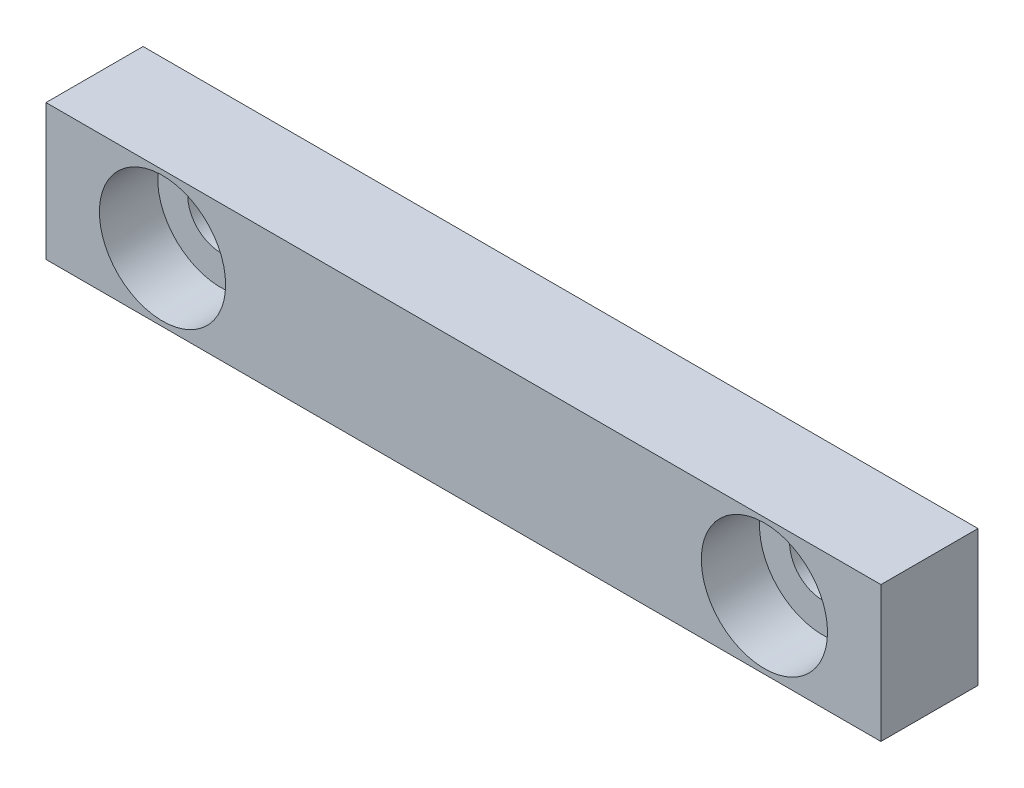
ISO-10303-21;
HEADER;
FILE_DESCRIPTION(('STEP AP214'),'2;1');
FILE_NAME('part.step','',(''),(''),'','','');
FILE_SCHEMA(('AUTOMOTIVE_DESIGN { 1 0 10303 214 1 1 1 1 }'));
ENDSEC;
DATA;
#1=APPLICATION_CONTEXT('core data for automotive mechanical design processes');
#2=APPLICATION_PROTOCOL_DEFINITION('international standard','automotive_design',2000,#1);
#3=PRODUCT_CONTEXT('',#1,'mechanical');
#4=PRODUCT('Part','Part','',(#3));
#5=PRODUCT_RELATED_PRODUCT_CATEGORY('part','',(#4));
#6=PRODUCT_DEFINITION_FORMATION('','',#4);
#7=PRODUCT_DEFINITION_CONTEXT('part definition',#1,'design');
#8=PRODUCT_DEFINITION('design','',#6,#7);
#9=PRODUCT_DEFINITION_SHAPE('','',#8);
#10=(LENGTH_UNIT() NAMED_UNIT(*) SI_UNIT(.MILLI.,.METRE.));
#11=(NAMED_UNIT(*) PLANE_ANGLE_UNIT() SI_UNIT($,.RADIAN.));
#12=(NAMED_UNIT(*) SI_UNIT($,.STERADIAN.) SOLID_ANGLE_UNIT());
#13=UNCERTAINTY_MEASURE_WITH_UNIT(LENGTH_MEASURE(1.E-05),#10,'distance_accuracy_value','');
#14=(GEOMETRIC_REPRESENTATION_CONTEXT(3) GLOBAL_UNCERTAINTY_ASSIGNED_CONTEXT((#13)) GLOBAL_UNIT_ASSIGNED_CONTEXT((#10,
#11,#12)) REPRESENTATION_CONTEXT('',''));
#15=CARTESIAN_POINT('',(0.,0.,0.));
#16=DIRECTION('',(0.,0.,1.));
#17=DIRECTION('',(1.,0.,0.));
#18=AXIS2_PLACEMENT_3D('',#15,#16,#17);
#19=CARTESIAN_POINT('',(-21.5,0.,5.));
#20=DIRECTION('',(1.,0.,0.));
#21=DIRECTION('',(0.,0.,-1.));
#22=AXIS2_PLACEMENT_3D('',#19,#20,#21);
#23=PLANE('',#22);
#24=DIRECTION('',(0.,-1.,0.));
#25=VECTOR('',#24,1.);
#26=CARTESIAN_POINT('',(-21.5,0.,0.));
#27=LINE('',#26,#25);
#28=CARTESIAN_POINT('',(-21.5,7.,0.));
#29=VERTEX_POINT('',#28);
#30=CARTESIAN_POINT('',(-21.5,0.,0.));
#31=VERTEX_POINT('',#30);
#32=EDGE_CURVE('E98',#29,#31,#27,.T.);
#33=ORIENTED_EDGE('',*,*,#32,.T.);
#34=DIRECTION('',(0.,0.,-1.));
#35=VECTOR('',#34,1.);
#36=CARTESIAN_POINT('',(-21.5,0.,5.));
#37=LINE('',#36,#35);
#38=CARTESIAN_POINT('',(-21.5,0.,5.));
#39=VERTEX_POINT('',#38);
#40=EDGE_CURVE('E11',#39,#31,#37,.T.);
#41=ORIENTED_EDGE('',*,*,#40,.F.);
#42=DIRECTION('',(0.,-1.,0.));
#43=VECTOR('',#42,1.);
#44=CARTESIAN_POINT('',(-21.5,0.,5.));
#45=LINE('',#44,#43);
#46=CARTESIAN_POINT('',(-21.5,7.,5.));
#47=VERTEX_POINT('',#46);
#48=EDGE_CURVE('E86',#47,#39,#45,.T.);
#49=ORIENTED_EDGE('',*,*,#48,.F.);
#50=DIRECTION('',(0.,0.,-1.));
#51=VECTOR('',#50,1.);
#52=CARTESIAN_POINT('',(-21.5,7.,5.));
#53=LINE('',#52,#51);
#54=EDGE_CURVE('E94',#47,#29,#53,.T.);
#55=ORIENTED_EDGE('',*,*,#54,.T.);
#56=EDGE_LOOP('',(#33,#41,#49,#55));
#57=FACE_BOUND('',#56,.T.);
#58=ADVANCED_FACE('F35',(#57),#23,.F.);
#59=CARTESIAN_POINT('',(-21.5,0.,5.));
#60=DIRECTION('',(0.,1.,0.));
#61=DIRECTION('',(0.,0.,1.));
#62=AXIS2_PLACEMENT_3D('',#59,#60,#61);
#63=PLANE('',#62);
#64=DIRECTION('',(1.,0.,0.));
#65=VECTOR('',#64,1.);
#66=CARTESIAN_POINT('',(-21.5,0.,0.));
#67=LINE('',#66,#65);
#68=CARTESIAN_POINT('',(21.5,0.,0.));
#69=VERTEX_POINT('',#68);
#70=EDGE_CURVE('E90',#31,#69,#67,.T.);
#71=ORIENTED_EDGE('',*,*,#70,.T.);
#72=DIRECTION('',(0.,0.,-1.));
#73=VECTOR('',#72,1.);
#74=CARTESIAN_POINT('',(21.5,0.,5.));
#75=LINE('',#74,#73);
#76=CARTESIAN_POINT('',(21.5,0.,5.));
#77=VERTEX_POINT('',#76);
#78=EDGE_CURVE('E43',#77,#69,#75,.T.);
#79=ORIENTED_EDGE('',*,*,#78,.F.);
#80=DIRECTION('',(1.,0.,0.));
#81=VECTOR('',#80,1.);
#82=CARTESIAN_POINT('',(-21.5,0.,5.));
#83=LINE('',#82,#81);
#84=EDGE_CURVE('E81',#39,#77,#83,.T.);
#85=ORIENTED_EDGE('',*,*,#84,.F.);
#86=ORIENTED_EDGE('',*,*,#40,.T.);
#87=EDGE_LOOP('',(#71,#79,#85,#86));
#88=FACE_BOUND('',#87,.T.);
#89=ADVANCED_FACE('F89',(#88),#63,.F.);
#90=CARTESIAN_POINT('',(21.5,0.,5.));
#91=DIRECTION('',(-1.,0.,0.));
#92=DIRECTION('',(0.,-1.,0.));
#93=AXIS2_PLACEMENT_3D('',#90,#91,#92);
#94=PLANE('',#93);
#95=DIRECTION('',(0.,1.,0.));
#96=VECTOR('',#95,1.);
#97=CARTESIAN_POINT('',(21.5,0.,0.));
#98=LINE('',#97,#96);
#99=CARTESIAN_POINT('',(21.5,7.,0.));
#100=VERTEX_POINT('',#99);
#101=EDGE_CURVE('E68',#69,#100,#98,.T.);
#102=ORIENTED_EDGE('',*,*,#101,.T.);
#103=DIRECTION('',(0.,0.,-1.));
#104=VECTOR('',#103,1.);
#105=CARTESIAN_POINT('',(21.5,7.,5.));
#106=LINE('',#105,#104);
#107=CARTESIAN_POINT('',(21.5,7.,5.));
#108=VERTEX_POINT('',#107);
#109=EDGE_CURVE('E91',#108,#100,#106,.T.);
#110=ORIENTED_EDGE('',*,*,#109,.F.);
#111=DIRECTION('',(0.,1.,0.));
#112=VECTOR('',#111,1.);
#113=CARTESIAN_POINT('',(21.5,0.,5.));
#114=LINE('',#113,#112);
#115=EDGE_CURVE('E84',#77,#108,#114,.T.);
#116=ORIENTED_EDGE('',*,*,#115,.F.);
#117=ORIENTED_EDGE('',*,*,#78,.T.);
#118=EDGE_LOOP('',(#102,#110,#116,#117));
#119=FACE_BOUND('',#118,.T.);
#120=ADVANCED_FACE('F92',(#119),#94,.F.);
#121=CARTESIAN_POINT('',(-21.5,7.,5.));
#122=DIRECTION('',(0.,-1.,0.));
#123=DIRECTION('',(1.,0.,0.));
#124=AXIS2_PLACEMENT_3D('',#121,#122,#123);
#125=PLANE('',#124);
#126=DIRECTION('',(-1.,0.,0.));
#127=VECTOR('',#126,1.);
#128=CARTESIAN_POINT('',(-21.5,7.,0.));
#129=LINE('',#128,#127);
#130=EDGE_CURVE('E74',#100,#29,#129,.T.);
#131=ORIENTED_EDGE('',*,*,#130,.T.);
#132=ORIENTED_EDGE('',*,*,#54,.F.);
#133=DIRECTION('',(-1.,0.,0.));
#134=VECTOR('',#133,1.);
#135=CARTESIAN_POINT('',(-21.5,7.,5.));
#136=LINE('',#135,#134);
#137=EDGE_CURVE('E51',#108,#47,#136,.T.);
#138=ORIENTED_EDGE('',*,*,#137,.F.);
#139=ORIENTED_EDGE('',*,*,#109,.T.);
#140=EDGE_LOOP('',(#131,#132,#138,#139));
#141=FACE_BOUND('',#140,.T.);
#142=ADVANCED_FACE('F106',(#141),#125,.F.);
#143=CARTESIAN_POINT('',(0.,0.,5.));
#144=DIRECTION('',(0.,0.,-1.));
#145=DIRECTION('',(-1.,0.,0.));
#146=AXIS2_PLACEMENT_3D('',#143,#144,#145);
#147=PLANE('',#146);
#148=CARTESIAN_POINT('',(-15.5,3.5,5.));
#149=DIRECTION('',(0.,0.,1.));
#150=DIRECTION('',(1.,0.,0.));
#151=AXIS2_PLACEMENT_3D('',#148,#149,#150);
#152=CIRCLE('',#151,3.25);
#153=CARTESIAN_POINT('',(-12.25,3.5,5.));
#154=VERTEX_POINT('',#153);
#155=EDGE_CURVE('E132',#154,#154,#152,.T.);
#156=ORIENTED_EDGE('',*,*,#155,.F.);
#157=EDGE_LOOP('',(#156));
#158=FACE_BOUND('',#157,.T.);
#159=CARTESIAN_POINT('',(15.5,3.5,5.));
#160=DIRECTION('',(0.,0.,1.));
#161=DIRECTION('',(1.,0.,0.));
#162=AXIS2_PLACEMENT_3D('',#159,#160,#161);
#163=CIRCLE('',#162,3.25);
#164=CARTESIAN_POINT('',(18.75,3.5,5.));
#165=VERTEX_POINT('',#164);
#166=EDGE_CURVE('E120',#165,#165,#163,.T.);
#167=ORIENTED_EDGE('',*,*,#166,.F.);
#168=EDGE_LOOP('',(#167));
#169=FACE_BOUND('',#168,.T.);
#170=ORIENTED_EDGE('',*,*,#48,.T.);
#171=ORIENTED_EDGE('',*,*,#84,.T.);
#172=ORIENTED_EDGE('',*,*,#115,.T.);
#173=ORIENTED_EDGE('',*,*,#137,.T.);
#174=EDGE_LOOP('',(#170,#171,#172,#173));
#175=FACE_BOUND('',#174,.T.);
#176=ADVANCED_FACE('F82',(#158,#169,#175),#147,.F.);
#177=CARTESIAN_POINT('',(0.,0.,0.));
#178=DIRECTION('',(0.,0.,-1.));
#179=DIRECTION('',(-1.,0.,0.));
#180=AXIS2_PLACEMENT_3D('',#177,#178,#179);
#181=PLANE('',#180);
#182=CARTESIAN_POINT('',(-15.5,3.5,0.));
#183=DIRECTION('',(0.,0.,1.));
#184=DIRECTION('',(1.,0.,0.));
#185=AXIS2_PLACEMENT_3D('',#182,#183,#184);
#186=CIRCLE('',#185,1.7);
#187=CARTESIAN_POINT('',(-13.8,3.5,0.));
#188=VERTEX_POINT('',#187);
#189=EDGE_CURVE('E123',#188,#188,#186,.T.);
#190=ORIENTED_EDGE('',*,*,#189,.T.);
#191=EDGE_LOOP('',(#190));
#192=FACE_BOUND('',#191,.T.);
#193=CARTESIAN_POINT('',(15.5,3.5,0.));
#194=DIRECTION('',(0.,0.,1.));
#195=DIRECTION('',(1.,0.,0.));
#196=AXIS2_PLACEMENT_3D('',#193,#194,#195);
#197=CIRCLE('',#196,1.7);
#198=CARTESIAN_POINT('',(17.2,3.5,0.));
#199=VERTEX_POINT('',#198);
#200=EDGE_CURVE('E101',#199,#199,#197,.T.);
#201=ORIENTED_EDGE('',*,*,#200,.T.);
#202=EDGE_LOOP('',(#201));
#203=FACE_BOUND('',#202,.T.);
#204=ORIENTED_EDGE('',*,*,#32,.F.);
#205=ORIENTED_EDGE('',*,*,#130,.F.);
#206=ORIENTED_EDGE('',*,*,#101,.F.);
#207=ORIENTED_EDGE('',*,*,#70,.F.);
#208=EDGE_LOOP('',(#204,#205,#206,#207));
#209=FACE_BOUND('',#208,.T.);
#210=ADVANCED_FACE('F109',(#192,#203,#209),#181,.T.);
#211=CARTESIAN_POINT('',(15.5,3.5,5.));
#212=DIRECTION('',(0.,0.,1.));
#213=DIRECTION('',(1.,0.,0.));
#214=AXIS2_PLACEMENT_3D('',#211,#212,#213);
#215=CYLINDRICAL_SURFACE('',#214,1.7);
#216=ORIENTED_EDGE('',*,*,#200,.F.);
#217=EDGE_LOOP('',(#216));
#218=FACE_BOUND('',#217,.T.);
#219=CARTESIAN_POINT('',(15.5,3.5,2.));
#220=DIRECTION('',(0.,0.,1.));
#221=DIRECTION('',(1.,0.,0.));
#222=AXIS2_PLACEMENT_3D('',#219,#220,#221);
#223=CIRCLE('',#222,1.7);
#224=CARTESIAN_POINT('',(17.2,3.5,2.));
#225=VERTEX_POINT('',#224);
#226=EDGE_CURVE('E114',#225,#225,#223,.T.);
#227=ORIENTED_EDGE('',*,*,#226,.T.);
#228=EDGE_LOOP('',(#227));
#229=FACE_BOUND('',#228,.T.);
#230=ADVANCED_FACE('F156',(#218,#229),#215,.F.);
#231=CARTESIAN_POINT('',(17.2,3.5,2.));
#232=DIRECTION('',(0.,0.,-1.));
#233=DIRECTION('',(-1.,0.,0.));
#234=AXIS2_PLACEMENT_3D('',#231,#232,#233);
#235=PLANE('',#234);
#236=ORIENTED_EDGE('',*,*,#226,.F.);
#237=EDGE_LOOP('',(#236));
#238=FACE_BOUND('',#237,.T.);
#239=CARTESIAN_POINT('',(15.5,3.5,2.));
#240=DIRECTION('',(0.,0.,1.));
#241=DIRECTION('',(1.,0.,0.));
#242=AXIS2_PLACEMENT_3D('',#239,#240,#241);
#243=CIRCLE('',#242,3.25);
#244=CARTESIAN_POINT('',(18.75,3.5,2.));
#245=VERTEX_POINT('',#244);
#246=EDGE_CURVE('E117',#245,#245,#243,.T.);
#247=ORIENTED_EDGE('',*,*,#246,.T.);
#248=EDGE_LOOP('',(#247));
#249=FACE_BOUND('',#248,.T.);
#250=ADVANCED_FACE('F146',(#238,#249),#235,.F.);
#251=CARTESIAN_POINT('',(15.5,3.5,5.));
#252=DIRECTION('',(0.,0.,1.));
#253=DIRECTION('',(1.,0.,0.));
#254=AXIS2_PLACEMENT_3D('',#251,#252,#253);
#255=CYLINDRICAL_SURFACE('',#254,3.25);
#256=ORIENTED_EDGE('',*,*,#246,.F.);
#257=EDGE_LOOP('',(#256));
#258=FACE_BOUND('',#257,.T.);
#259=ORIENTED_EDGE('',*,*,#166,.T.);
#260=EDGE_LOOP('',(#259));
#261=FACE_BOUND('',#260,.T.);
#262=ADVANCED_FACE('F143',(#258,#261),#255,.F.);
#263=CARTESIAN_POINT('',(-15.5,3.5,5.));
#264=DIRECTION('',(0.,0.,1.));
#265=DIRECTION('',(1.,0.,0.));
#266=AXIS2_PLACEMENT_3D('',#263,#264,#265);
#267=CYLINDRICAL_SURFACE('',#266,1.7);
#268=ORIENTED_EDGE('',*,*,#189,.F.);
#269=EDGE_LOOP('',(#268));
#270=FACE_BOUND('',#269,.T.);
#271=CARTESIAN_POINT('',(-15.5,3.5,2.));
#272=DIRECTION('',(0.,0.,1.));
#273=DIRECTION('',(1.,0.,0.));
#274=AXIS2_PLACEMENT_3D('',#271,#272,#273);
#275=CIRCLE('',#274,1.7);
#276=CARTESIAN_POINT('',(-13.8,3.5,2.));
#277=VERTEX_POINT('',#276);
#278=EDGE_CURVE('E126',#277,#277,#275,.T.);
#279=ORIENTED_EDGE('',*,*,#278,.T.);
#280=EDGE_LOOP('',(#279));
#281=FACE_BOUND('',#280,.T.);
#282=ADVANCED_FACE('F145',(#270,#281),#267,.F.);
#283=CARTESIAN_POINT('',(-13.8,3.5,2.));
#284=DIRECTION('',(0.,0.,-1.));
#285=DIRECTION('',(-1.,0.,0.));
#286=AXIS2_PLACEMENT_3D('',#283,#284,#285);
#287=PLANE('',#286);
#288=ORIENTED_EDGE('',*,*,#278,.F.);
#289=EDGE_LOOP('',(#288));
#290=FACE_BOUND('',#289,.T.);
#291=CARTESIAN_POINT('',(-15.5,3.5,2.));
#292=DIRECTION('',(0.,0.,1.));
#293=DIRECTION('',(1.,0.,0.));
#294=AXIS2_PLACEMENT_3D('',#291,#292,#293);
#295=CIRCLE('',#294,3.25);
#296=CARTESIAN_POINT('',(-12.25,3.5,2.));
#297=VERTEX_POINT('',#296);
#298=EDGE_CURVE('E129',#297,#297,#295,.T.);
#299=ORIENTED_EDGE('',*,*,#298,.T.);
#300=EDGE_LOOP('',(#299));
#301=FACE_BOUND('',#300,.T.);
#302=ADVANCED_FACE('F153',(#290,#301),#287,.F.);
#303=CARTESIAN_POINT('',(-15.5,3.5,5.));
#304=DIRECTION('',(0.,0.,1.));
#305=DIRECTION('',(1.,0.,0.));
#306=AXIS2_PLACEMENT_3D('',#303,#304,#305);
#307=CYLINDRICAL_SURFACE('',#306,3.25);
#308=ORIENTED_EDGE('',*,*,#298,.F.);
#309=EDGE_LOOP('',(#308));
#310=FACE_BOUND('',#309,.T.);
#311=ORIENTED_EDGE('',*,*,#155,.T.);
#312=EDGE_LOOP('',(#311));
#313=FACE_BOUND('',#312,.T.);
#314=ADVANCED_FACE('F136',(#310,#313),#307,.F.);
#315=CLOSED_SHELL('',(#58,#89,#120,#142,#176,#210,#230,#250,#262,#282,#302,#314));
#316=MANIFOLD_SOLID_BREP('B2',#315);
#317=ADVANCED_BREP_SHAPE_REPRESENTATION('',(#18,#316),#14);
#318=SHAPE_DEFINITION_REPRESENTATION(#9,#317);
ENDSEC;
END-ISO-10303-21;
